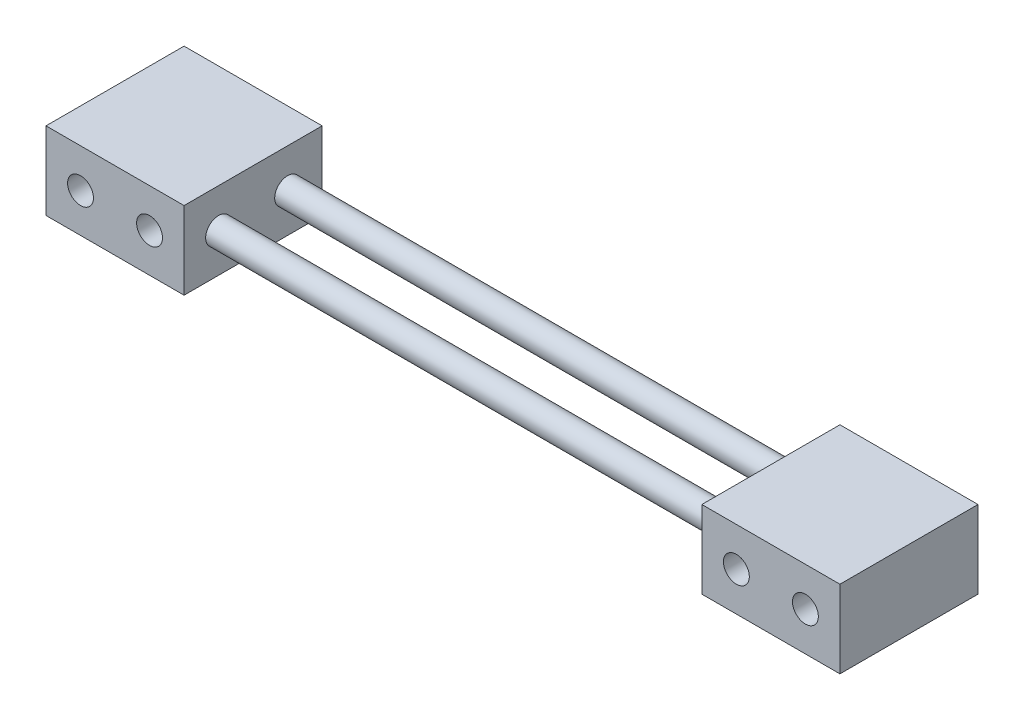
ISO-10303-21;
HEADER;
FILE_DESCRIPTION(('STEP AP214'),'2;1');
FILE_NAME('part.step','',(''),(''),'','','');
FILE_SCHEMA(('AUTOMOTIVE_DESIGN { 1 0 10303 214 1 1 1 1 }'));
ENDSEC;
DATA;
#1=APPLICATION_CONTEXT('core data for automotive mechanical design processes');
#2=APPLICATION_PROTOCOL_DEFINITION('international standard','automotive_design',2000,#1);
#3=PRODUCT_CONTEXT('',#1,'mechanical');
#4=PRODUCT('Part','Part','',(#3));
#5=PRODUCT_RELATED_PRODUCT_CATEGORY('part','',(#4));
#6=PRODUCT_DEFINITION_FORMATION('','',#4);
#7=PRODUCT_DEFINITION_CONTEXT('part definition',#1,'design');
#8=PRODUCT_DEFINITION('design','',#6,#7);
#9=PRODUCT_DEFINITION_SHAPE('','',#8);
#10=(LENGTH_UNIT() NAMED_UNIT(*) SI_UNIT(.MILLI.,.METRE.));
#11=(NAMED_UNIT(*) PLANE_ANGLE_UNIT() SI_UNIT($,.RADIAN.));
#12=(NAMED_UNIT(*) SI_UNIT($,.STERADIAN.) SOLID_ANGLE_UNIT());
#13=UNCERTAINTY_MEASURE_WITH_UNIT(LENGTH_MEASURE(1.E-05),#10,'distance_accuracy_value','');
#14=(GEOMETRIC_REPRESENTATION_CONTEXT(3) GLOBAL_UNCERTAINTY_ASSIGNED_CONTEXT((#13)) GLOBAL_UNIT_ASSIGNED_CONTEXT((#10,
#11,#12)) REPRESENTATION_CONTEXT('',''));
#15=CARTESIAN_POINT('',(0.,0.,0.));
#16=DIRECTION('',(0.,0.,1.));
#17=DIRECTION('',(1.,0.,0.));
#18=AXIS2_PLACEMENT_3D('',#15,#16,#17);
#19=CARTESIAN_POINT('',(0.,45.,0.));
#20=DIRECTION('',(-1.,0.,0.));
#21=DIRECTION('',(0.,0.,1.));
#22=AXIS2_PLACEMENT_3D('',#19,#20,#21);
#23=PLANE('',#22);
#24=CARTESIAN_POINT('',(0.,22.5,-20.));
#25=DIRECTION('',(-1.,0.,0.));
#26=DIRECTION('',(0.,0.,1.));
#27=AXIS2_PLACEMENT_3D('',#24,#25,#26);
#28=CIRCLE('',#27,7.5);
#29=CARTESIAN_POINT('',(0.,22.5,-12.5));
#30=VERTEX_POINT('',#29);
#31=EDGE_CURVE('E11',#30,#30,#28,.F.);
#32=ORIENTED_EDGE('',*,*,#31,.F.);
#33=EDGE_LOOP('',(#32));
#34=FACE_BOUND('',#33,.T.);
#35=CARTESIAN_POINT('',(0.,22.5,-60.));
#36=DIRECTION('',(-1.,0.,0.));
#37=DIRECTION('',(0.,0.,1.));
#38=AXIS2_PLACEMENT_3D('',#35,#36,#37);
#39=CIRCLE('',#38,7.50000000000001);
#40=CARTESIAN_POINT('',(0.,22.5,-52.5));
#41=VERTEX_POINT('',#40);
#42=EDGE_CURVE('E59',#41,#41,#39,.F.);
#43=ORIENTED_EDGE('',*,*,#42,.F.);
#44=EDGE_LOOP('',(#43));
#45=FACE_BOUND('',#44,.T.);
#46=DIRECTION('',(0.,0.,-1.));
#47=VECTOR('',#46,1.);
#48=CARTESIAN_POINT('',(0.,0.,0.));
#49=LINE('',#48,#47);
#50=CARTESIAN_POINT('',(0.,0.,0.));
#51=VERTEX_POINT('',#50);
#52=CARTESIAN_POINT('',(0.,0.,-80.));
#53=VERTEX_POINT('',#52);
#54=EDGE_CURVE('E195',#51,#53,#49,.T.);
#55=ORIENTED_EDGE('',*,*,#54,.T.);
#56=DIRECTION('',(0.,-1.,0.));
#57=VECTOR('',#56,1.);
#58=CARTESIAN_POINT('',(0.,45.,-80.));
#59=LINE('',#58,#57);
#60=CARTESIAN_POINT('',(0.,45.,-80.));
#61=VERTEX_POINT('',#60);
#62=EDGE_CURVE('E236',#61,#53,#59,.T.);
#63=ORIENTED_EDGE('',*,*,#62,.F.);
#64=DIRECTION('',(0.,0.,-1.));
#65=VECTOR('',#64,1.);
#66=CARTESIAN_POINT('',(0.,45.,0.));
#67=LINE('',#66,#65);
#68=CARTESIAN_POINT('',(0.,45.,0.));
#69=VERTEX_POINT('',#68);
#70=EDGE_CURVE('E207',#69,#61,#67,.T.);
#71=ORIENTED_EDGE('',*,*,#70,.F.);
#72=DIRECTION('',(0.,-1.,0.));
#73=VECTOR('',#72,1.);
#74=CARTESIAN_POINT('',(0.,45.,0.));
#75=LINE('',#74,#73);
#76=EDGE_CURVE('E217',#69,#51,#75,.T.);
#77=ORIENTED_EDGE('',*,*,#76,.T.);
#78=EDGE_LOOP('',(#55,#63,#71,#77));
#79=FACE_BOUND('',#78,.T.);
#80=ADVANCED_FACE('F50',(#34,#45,#79),#23,.F.);
#81=CARTESIAN_POINT('',(0.,45.,-80.));
#82=DIRECTION('',(0.,0.,1.));
#83=DIRECTION('',(1.,0.,0.));
#84=AXIS2_PLACEMENT_3D('',#81,#82,#83);
#85=PLANE('',#84);
#86=CARTESIAN_POINT('',(-60.,22.5,-80.));
#87=DIRECTION('',(0.,0.,1.));
#88=DIRECTION('',(1.,0.,0.));
#89=AXIS2_PLACEMENT_3D('',#86,#87,#88);
#90=CIRCLE('',#89,7.5);
#91=CARTESIAN_POINT('',(-52.5,22.5,-80.));
#92=VERTEX_POINT('',#91);
#93=EDGE_CURVE('E191',#92,#92,#90,.T.);
#94=ORIENTED_EDGE('',*,*,#93,.T.);
#95=EDGE_LOOP('',(#94));
#96=FACE_BOUND('',#95,.T.);
#97=CARTESIAN_POINT('',(-20.,22.5,-80.));
#98=DIRECTION('',(0.,0.,1.));
#99=DIRECTION('',(1.,0.,0.));
#100=AXIS2_PLACEMENT_3D('',#97,#98,#99);
#101=CIRCLE('',#100,7.5);
#102=CARTESIAN_POINT('',(-12.5,22.5,-80.));
#103=VERTEX_POINT('',#102);
#104=EDGE_CURVE('E187',#103,#103,#101,.T.);
#105=ORIENTED_EDGE('',*,*,#104,.T.);
#106=EDGE_LOOP('',(#105));
#107=FACE_BOUND('',#106,.T.);
#108=DIRECTION('',(-1.,0.,0.));
#109=VECTOR('',#108,1.);
#110=CARTESIAN_POINT('',(0.,0.,-80.));
#111=LINE('',#110,#109);
#112=CARTESIAN_POINT('',(-80.,0.,-80.));
#113=VERTEX_POINT('',#112);
#114=EDGE_CURVE('E221',#53,#113,#111,.T.);
#115=ORIENTED_EDGE('',*,*,#114,.T.);
#116=DIRECTION('',(0.,-1.,0.));
#117=VECTOR('',#116,1.);
#118=CARTESIAN_POINT('',(-80.,45.,-80.));
#119=LINE('',#118,#117);
#120=CARTESIAN_POINT('',(-80.,45.,-80.));
#121=VERTEX_POINT('',#120);
#122=EDGE_CURVE('E233',#121,#113,#119,.T.);
#123=ORIENTED_EDGE('',*,*,#122,.F.);
#124=DIRECTION('',(-1.,0.,0.));
#125=VECTOR('',#124,1.);
#126=CARTESIAN_POINT('',(0.,45.,-80.));
#127=LINE('',#126,#125);
#128=EDGE_CURVE('E99',#61,#121,#127,.T.);
#129=ORIENTED_EDGE('',*,*,#128,.F.);
#130=ORIENTED_EDGE('',*,*,#62,.T.);
#131=EDGE_LOOP('',(#115,#123,#129,#130));
#132=FACE_BOUND('',#131,.T.);
#133=ADVANCED_FACE('F246',(#96,#107,#132),#85,.F.);
#134=CARTESIAN_POINT('',(-80.,45.,0.));
#135=DIRECTION('',(1.,0.,0.));
#136=DIRECTION('',(0.,0.,-1.));
#137=AXIS2_PLACEMENT_3D('',#134,#135,#136);
#138=PLANE('',#137);
#139=DIRECTION('',(0.,0.,1.));
#140=VECTOR('',#139,1.);
#141=CARTESIAN_POINT('',(-80.,0.,0.));
#142=LINE('',#141,#140);
#143=CARTESIAN_POINT('',(-80.,0.,0.));
#144=VERTEX_POINT('',#143);
#145=EDGE_CURVE('E85',#113,#144,#142,.T.);
#146=ORIENTED_EDGE('',*,*,#145,.T.);
#147=DIRECTION('',(0.,-1.,0.));
#148=VECTOR('',#147,1.);
#149=CARTESIAN_POINT('',(-80.,45.,0.));
#150=LINE('',#149,#148);
#151=CARTESIAN_POINT('',(-80.,45.,0.));
#152=VERTEX_POINT('',#151);
#153=EDGE_CURVE('E230',#152,#144,#150,.T.);
#154=ORIENTED_EDGE('',*,*,#153,.F.);
#155=DIRECTION('',(0.,0.,1.));
#156=VECTOR('',#155,1.);
#157=CARTESIAN_POINT('',(-80.,45.,0.));
#158=LINE('',#157,#156);
#159=EDGE_CURVE('E212',#121,#152,#158,.T.);
#160=ORIENTED_EDGE('',*,*,#159,.F.);
#161=ORIENTED_EDGE('',*,*,#122,.T.);
#162=EDGE_LOOP('',(#146,#154,#160,#161));
#163=FACE_BOUND('',#162,.T.);
#164=ADVANCED_FACE('F254',(#163),#138,.F.);
#165=CARTESIAN_POINT('',(0.,45.,0.));
#166=DIRECTION('',(0.,0.,-1.));
#167=DIRECTION('',(-1.,0.,0.));
#168=AXIS2_PLACEMENT_3D('',#165,#166,#167);
#169=PLANE('',#168);
#170=CARTESIAN_POINT('',(-60.,22.5,0.));
#171=DIRECTION('',(0.,0.,1.));
#172=DIRECTION('',(1.,0.,0.));
#173=AXIS2_PLACEMENT_3D('',#170,#171,#172);
#174=CIRCLE('',#173,7.5);
#175=CARTESIAN_POINT('',(-52.5,22.5,0.));
#176=VERTEX_POINT('',#175);
#177=EDGE_CURVE('E196',#176,#176,#174,.T.);
#178=ORIENTED_EDGE('',*,*,#177,.F.);
#179=EDGE_LOOP('',(#178));
#180=FACE_BOUND('',#179,.T.);
#181=CARTESIAN_POINT('',(-20.,22.5,0.));
#182=DIRECTION('',(0.,0.,1.));
#183=DIRECTION('',(1.,0.,0.));
#184=AXIS2_PLACEMENT_3D('',#181,#182,#183);
#185=CIRCLE('',#184,7.5);
#186=CARTESIAN_POINT('',(-12.5,22.5,0.));
#187=VERTEX_POINT('',#186);
#188=EDGE_CURVE('E200',#187,#187,#185,.T.);
#189=ORIENTED_EDGE('',*,*,#188,.F.);
#190=EDGE_LOOP('',(#189));
#191=FACE_BOUND('',#190,.T.);
#192=DIRECTION('',(1.,0.,0.));
#193=VECTOR('',#192,1.);
#194=CARTESIAN_POINT('',(0.,0.,0.));
#195=LINE('',#194,#193);
#196=EDGE_CURVE('E91',#144,#51,#195,.T.);
#197=ORIENTED_EDGE('',*,*,#196,.T.);
#198=ORIENTED_EDGE('',*,*,#76,.F.);
#199=DIRECTION('',(1.,0.,0.));
#200=VECTOR('',#199,1.);
#201=CARTESIAN_POINT('',(0.,45.,0.));
#202=LINE('',#201,#200);
#203=EDGE_CURVE('E67',#152,#69,#202,.T.);
#204=ORIENTED_EDGE('',*,*,#203,.F.);
#205=ORIENTED_EDGE('',*,*,#153,.T.);
#206=EDGE_LOOP('',(#197,#198,#204,#205));
#207=FACE_BOUND('',#206,.T.);
#208=ADVANCED_FACE('F259',(#180,#191,#207),#169,.F.);
#209=CARTESIAN_POINT('',(0.,45.,0.));
#210=DIRECTION('',(0.,1.,0.));
#211=DIRECTION('',(0.,0.,1.));
#212=AXIS2_PLACEMENT_3D('',#209,#210,#211);
#213=PLANE('',#212);
#214=ORIENTED_EDGE('',*,*,#70,.T.);
#215=ORIENTED_EDGE('',*,*,#128,.T.);
#216=ORIENTED_EDGE('',*,*,#159,.T.);
#217=ORIENTED_EDGE('',*,*,#203,.T.);
#218=EDGE_LOOP('',(#214,#215,#216,#217));
#219=FACE_BOUND('',#218,.T.);
#220=ADVANCED_FACE('F265',(#219),#213,.T.);
#221=CARTESIAN_POINT('',(0.,0.,0.));
#222=DIRECTION('',(0.,1.,0.));
#223=DIRECTION('',(0.,0.,1.));
#224=AXIS2_PLACEMENT_3D('',#221,#222,#223);
#225=PLANE('',#224);
#226=ORIENTED_EDGE('',*,*,#54,.F.);
#227=ORIENTED_EDGE('',*,*,#196,.F.);
#228=ORIENTED_EDGE('',*,*,#145,.F.);
#229=ORIENTED_EDGE('',*,*,#114,.F.);
#230=EDGE_LOOP('',(#226,#227,#228,#229));
#231=FACE_BOUND('',#230,.T.);
#232=ADVANCED_FACE('F252',(#231),#225,.F.);
#233=CARTESIAN_POINT('',(-20.,22.5,-80.));
#234=DIRECTION('',(0.,0.,1.));
#235=DIRECTION('',(1.,0.,0.));
#236=AXIS2_PLACEMENT_3D('',#233,#234,#235);
#237=CYLINDRICAL_SURFACE('',#236,7.5);
#238=ORIENTED_EDGE('',*,*,#104,.F.);
#239=EDGE_LOOP('',(#238));
#240=FACE_BOUND('',#239,.T.);
#241=ORIENTED_EDGE('',*,*,#188,.T.);
#242=EDGE_LOOP('',(#241));
#243=FACE_BOUND('',#242,.T.);
#244=ADVANCED_FACE('F269',(#240,#243),#237,.F.);
#245=CARTESIAN_POINT('',(-60.,22.5,-80.));
#246=DIRECTION('',(0.,0.,1.));
#247=DIRECTION('',(1.,0.,0.));
#248=AXIS2_PLACEMENT_3D('',#245,#246,#247);
#249=CYLINDRICAL_SURFACE('',#248,7.5);
#250=ORIENTED_EDGE('',*,*,#93,.F.);
#251=EDGE_LOOP('',(#250));
#252=FACE_BOUND('',#251,.T.);
#253=ORIENTED_EDGE('',*,*,#177,.T.);
#254=EDGE_LOOP('',(#253));
#255=FACE_BOUND('',#254,.T.);
#256=ADVANCED_FACE('F274',(#252,#255),#249,.F.);
#257=CARTESIAN_POINT('',(300.,22.5,-60.));
#258=DIRECTION('',(-1.,0.,0.));
#259=DIRECTION('',(0.,0.,1.));
#260=AXIS2_PLACEMENT_3D('',#257,#258,#259);
#261=CYLINDRICAL_SURFACE('',#260,7.50000000000001);
#262=CARTESIAN_POINT('',(300.,22.5,-60.));
#263=DIRECTION('',(1.,0.,0.));
#264=DIRECTION('',(0.,0.,-1.));
#265=AXIS2_PLACEMENT_3D('',#262,#263,#264);
#266=CIRCLE('',#265,7.50000000000001);
#267=CARTESIAN_POINT('',(300.,22.5,-67.5));
#268=VERTEX_POINT('',#267);
#269=EDGE_CURVE('E138',#268,#268,#266,.T.);
#270=ORIENTED_EDGE('',*,*,#269,.F.);
#271=EDGE_LOOP('',(#270));
#272=FACE_BOUND('',#271,.T.);
#273=ORIENTED_EDGE('',*,*,#42,.T.);
#274=EDGE_LOOP('',(#273));
#275=FACE_BOUND('',#274,.T.);
#276=ADVANCED_FACE('F242',(#272,#275),#261,.T.);
#277=CARTESIAN_POINT('',(300.,22.5,-20.));
#278=DIRECTION('',(-1.,0.,0.));
#279=DIRECTION('',(0.,0.,1.));
#280=AXIS2_PLACEMENT_3D('',#277,#278,#279);
#281=CYLINDRICAL_SURFACE('',#280,7.5);
#282=CARTESIAN_POINT('',(300.,22.5,-20.));
#283=DIRECTION('',(1.,0.,0.));
#284=DIRECTION('',(0.,0.,-1.));
#285=AXIS2_PLACEMENT_3D('',#282,#283,#284);
#286=CIRCLE('',#285,7.5);
#287=CARTESIAN_POINT('',(300.,22.5,-27.5));
#288=VERTEX_POINT('',#287);
#289=EDGE_CURVE('E183',#288,#288,#286,.T.);
#290=ORIENTED_EDGE('',*,*,#289,.F.);
#291=EDGE_LOOP('',(#290));
#292=FACE_BOUND('',#291,.T.);
#293=ORIENTED_EDGE('',*,*,#31,.T.);
#294=EDGE_LOOP('',(#293));
#295=FACE_BOUND('',#294,.T.);
#296=ADVANCED_FACE('F281',(#292,#295),#281,.T.);
#297=CARTESIAN_POINT('',(300.,45.,0.));
#298=DIRECTION('',(-1.,0.,0.));
#299=DIRECTION('',(0.,0.,1.));
#300=AXIS2_PLACEMENT_3D('',#297,#298,#299);
#301=PLANE('',#300);
#302=ORIENTED_EDGE('',*,*,#269,.T.);
#303=EDGE_LOOP('',(#302));
#304=FACE_BOUND('',#303,.T.);
#305=ORIENTED_EDGE('',*,*,#289,.T.);
#306=EDGE_LOOP('',(#305));
#307=FACE_BOUND('',#306,.T.);
#308=DIRECTION('',(0.,0.,-1.));
#309=VECTOR('',#308,1.);
#310=CARTESIAN_POINT('',(300.,0.,0.));
#311=LINE('',#310,#309);
#312=CARTESIAN_POINT('',(300.,0.,0.));
#313=VERTEX_POINT('',#312);
#314=CARTESIAN_POINT('',(300.,0.,-80.));
#315=VERTEX_POINT('',#314);
#316=EDGE_CURVE('E132',#313,#315,#311,.T.);
#317=ORIENTED_EDGE('',*,*,#316,.F.);
#318=DIRECTION('',(0.,-1.,0.));
#319=VECTOR('',#318,1.);
#320=CARTESIAN_POINT('',(300.,45.,0.));
#321=LINE('',#320,#319);
#322=CARTESIAN_POINT('',(300.,45.,0.));
#323=VERTEX_POINT('',#322);
#324=EDGE_CURVE('E126',#323,#313,#321,.T.);
#325=ORIENTED_EDGE('',*,*,#324,.F.);
#326=DIRECTION('',(0.,0.,-1.));
#327=VECTOR('',#326,1.);
#328=CARTESIAN_POINT('',(300.,45.,0.));
#329=LINE('',#328,#327);
#330=CARTESIAN_POINT('',(300.,45.,-80.));
#331=VERTEX_POINT('',#330);
#332=EDGE_CURVE('E129',#323,#331,#329,.T.);
#333=ORIENTED_EDGE('',*,*,#332,.T.);
#334=DIRECTION('',(0.,-1.,0.));
#335=VECTOR('',#334,1.);
#336=CARTESIAN_POINT('',(300.,45.,-80.));
#337=LINE('',#336,#335);
#338=EDGE_CURVE('E162',#331,#315,#337,.T.);
#339=ORIENTED_EDGE('',*,*,#338,.T.);
#340=EDGE_LOOP('',(#317,#325,#333,#339));
#341=FACE_BOUND('',#340,.T.);
#342=ADVANCED_FACE('F128',(#304,#307,#341),#301,.T.);
#343=CARTESIAN_POINT('',(300.,45.,0.));
#344=DIRECTION('',(0.,0.,1.));
#345=DIRECTION('',(1.,0.,0.));
#346=AXIS2_PLACEMENT_3D('',#343,#344,#345);
#347=PLANE('',#346);
#348=CARTESIAN_POINT('',(360.,22.5,0.));
#349=DIRECTION('',(0.,0.,-1.));
#350=DIRECTION('',(-1.,0.,0.));
#351=AXIS2_PLACEMENT_3D('',#348,#349,#350);
#352=CIRCLE('',#351,7.5);
#353=CARTESIAN_POINT('',(352.5,22.5,0.));
#354=VERTEX_POINT('',#353);
#355=EDGE_CURVE('E320',#354,#354,#352,.T.);
#356=ORIENTED_EDGE('',*,*,#355,.T.);
#357=EDGE_LOOP('',(#356));
#358=FACE_BOUND('',#357,.T.);
#359=CARTESIAN_POINT('',(320.,22.5,0.));
#360=DIRECTION('',(0.,0.,-1.));
#361=DIRECTION('',(-1.,0.,0.));
#362=AXIS2_PLACEMENT_3D('',#359,#360,#361);
#363=CIRCLE('',#362,7.5);
#364=CARTESIAN_POINT('',(312.5,22.5,0.));
#365=VERTEX_POINT('',#364);
#366=EDGE_CURVE('E328',#365,#365,#363,.T.);
#367=ORIENTED_EDGE('',*,*,#366,.T.);
#368=EDGE_LOOP('',(#367));
#369=FACE_BOUND('',#368,.T.);
#370=DIRECTION('',(-1.,0.,0.));
#371=VECTOR('',#370,1.);
#372=CARTESIAN_POINT('',(300.,0.,0.));
#373=LINE('',#372,#371);
#374=CARTESIAN_POINT('',(380.,0.,0.));
#375=VERTEX_POINT('',#374);
#376=EDGE_CURVE('E165',#375,#313,#373,.T.);
#377=ORIENTED_EDGE('',*,*,#376,.F.);
#378=DIRECTION('',(0.,-1.,0.));
#379=VECTOR('',#378,1.);
#380=CARTESIAN_POINT('',(380.,45.,0.));
#381=LINE('',#380,#379);
#382=CARTESIAN_POINT('',(380.,45.,0.));
#383=VERTEX_POINT('',#382);
#384=EDGE_CURVE('E139',#383,#375,#381,.T.);
#385=ORIENTED_EDGE('',*,*,#384,.F.);
#386=DIRECTION('',(-1.,0.,0.));
#387=VECTOR('',#386,1.);
#388=CARTESIAN_POINT('',(300.,45.,0.));
#389=LINE('',#388,#387);
#390=EDGE_CURVE('E145',#383,#323,#389,.T.);
#391=ORIENTED_EDGE('',*,*,#390,.T.);
#392=ORIENTED_EDGE('',*,*,#324,.T.);
#393=EDGE_LOOP('',(#377,#385,#391,#392));
#394=FACE_BOUND('',#393,.T.);
#395=ADVANCED_FACE('F152',(#358,#369,#394),#347,.T.);
#396=CARTESIAN_POINT('',(380.,45.,0.));
#397=DIRECTION('',(1.,0.,0.));
#398=DIRECTION('',(0.,0.,-1.));
#399=AXIS2_PLACEMENT_3D('',#396,#397,#398);
#400=PLANE('',#399);
#401=DIRECTION('',(0.,0.,1.));
#402=VECTOR('',#401,1.);
#403=CARTESIAN_POINT('',(380.,0.,0.));
#404=LINE('',#403,#402);
#405=CARTESIAN_POINT('',(380.,0.,-80.));
#406=VERTEX_POINT('',#405);
#407=EDGE_CURVE('E169',#406,#375,#404,.T.);
#408=ORIENTED_EDGE('',*,*,#407,.F.);
#409=DIRECTION('',(0.,-1.,0.));
#410=VECTOR('',#409,1.);
#411=CARTESIAN_POINT('',(380.,45.,-80.));
#412=LINE('',#411,#410);
#413=CARTESIAN_POINT('',(380.,45.,-80.));
#414=VERTEX_POINT('',#413);
#415=EDGE_CURVE('E178',#414,#406,#412,.T.);
#416=ORIENTED_EDGE('',*,*,#415,.F.);
#417=DIRECTION('',(0.,0.,1.));
#418=VECTOR('',#417,1.);
#419=CARTESIAN_POINT('',(380.,45.,0.));
#420=LINE('',#419,#418);
#421=EDGE_CURVE('E154',#414,#383,#420,.T.);
#422=ORIENTED_EDGE('',*,*,#421,.T.);
#423=ORIENTED_EDGE('',*,*,#384,.T.);
#424=EDGE_LOOP('',(#408,#416,#422,#423));
#425=FACE_BOUND('',#424,.T.);
#426=ADVANCED_FACE('F291',(#425),#400,.T.);
#427=CARTESIAN_POINT('',(300.,45.,-80.));
#428=DIRECTION('',(0.,0.,-1.));
#429=DIRECTION('',(-1.,0.,0.));
#430=AXIS2_PLACEMENT_3D('',#427,#428,#429);
#431=PLANE('',#430);
#432=CARTESIAN_POINT('',(360.,22.5,-80.));
#433=DIRECTION('',(0.,0.,-1.));
#434=DIRECTION('',(-1.,0.,0.));
#435=AXIS2_PLACEMENT_3D('',#432,#433,#434);
#436=CIRCLE('',#435,7.5);
#437=CARTESIAN_POINT('',(352.5,22.5,-80.));
#438=VERTEX_POINT('',#437);
#439=EDGE_CURVE('E166',#438,#438,#436,.T.);
#440=ORIENTED_EDGE('',*,*,#439,.F.);
#441=EDGE_LOOP('',(#440));
#442=FACE_BOUND('',#441,.T.);
#443=CARTESIAN_POINT('',(320.,22.5,-80.));
#444=DIRECTION('',(0.,0.,-1.));
#445=DIRECTION('',(-1.,0.,0.));
#446=AXIS2_PLACEMENT_3D('',#443,#444,#445);
#447=CIRCLE('',#446,7.5);
#448=CARTESIAN_POINT('',(312.5,22.5,-80.));
#449=VERTEX_POINT('',#448);
#450=EDGE_CURVE('E322',#449,#449,#447,.T.);
#451=ORIENTED_EDGE('',*,*,#450,.F.);
#452=EDGE_LOOP('',(#451));
#453=FACE_BOUND('',#452,.T.);
#454=DIRECTION('',(1.,0.,0.));
#455=VECTOR('',#454,1.);
#456=CARTESIAN_POINT('',(300.,0.,-80.));
#457=LINE('',#456,#455);
#458=EDGE_CURVE('E150',#315,#406,#457,.T.);
#459=ORIENTED_EDGE('',*,*,#458,.F.);
#460=ORIENTED_EDGE('',*,*,#338,.F.);
#461=DIRECTION('',(1.,0.,0.));
#462=VECTOR('',#461,1.);
#463=CARTESIAN_POINT('',(300.,45.,-80.));
#464=LINE('',#463,#462);
#465=EDGE_CURVE('E148',#331,#414,#464,.T.);
#466=ORIENTED_EDGE('',*,*,#465,.T.);
#467=ORIENTED_EDGE('',*,*,#415,.T.);
#468=EDGE_LOOP('',(#459,#460,#466,#467));
#469=FACE_BOUND('',#468,.T.);
#470=ADVANCED_FACE('F295',(#442,#453,#469),#431,.T.);
#471=CARTESIAN_POINT('',(300.,45.,0.));
#472=DIRECTION('',(0.,1.,0.));
#473=DIRECTION('',(0.,0.,1.));
#474=AXIS2_PLACEMENT_3D('',#471,#472,#473);
#475=PLANE('',#474);
#476=ORIENTED_EDGE('',*,*,#332,.F.);
#477=ORIENTED_EDGE('',*,*,#390,.F.);
#478=ORIENTED_EDGE('',*,*,#421,.F.);
#479=ORIENTED_EDGE('',*,*,#465,.F.);
#480=EDGE_LOOP('',(#476,#477,#478,#479));
#481=FACE_BOUND('',#480,.T.);
#482=ADVANCED_FACE('F143',(#481),#475,.T.);
#483=CARTESIAN_POINT('',(300.,0.,0.));
#484=DIRECTION('',(0.,1.,0.));
#485=DIRECTION('',(0.,0.,1.));
#486=AXIS2_PLACEMENT_3D('',#483,#484,#485);
#487=PLANE('',#486);
#488=ORIENTED_EDGE('',*,*,#316,.T.);
#489=ORIENTED_EDGE('',*,*,#458,.T.);
#490=ORIENTED_EDGE('',*,*,#407,.T.);
#491=ORIENTED_EDGE('',*,*,#376,.T.);
#492=EDGE_LOOP('',(#488,#489,#490,#491));
#493=FACE_BOUND('',#492,.T.);
#494=ADVANCED_FACE('F300',(#493),#487,.F.);
#495=CARTESIAN_POINT('',(320.,22.5,-80.));
#496=DIRECTION('',(0.,0.,1.));
#497=DIRECTION('',(1.,0.,0.));
#498=AXIS2_PLACEMENT_3D('',#495,#496,#497);
#499=CYLINDRICAL_SURFACE('',#498,7.5);
#500=ORIENTED_EDGE('',*,*,#450,.T.);
#501=EDGE_LOOP('',(#500));
#502=FACE_BOUND('',#501,.T.);
#503=ORIENTED_EDGE('',*,*,#366,.F.);
#504=EDGE_LOOP('',(#503));
#505=FACE_BOUND('',#504,.T.);
#506=ADVANCED_FACE('F303',(#502,#505),#499,.F.);
#507=CARTESIAN_POINT('',(360.,22.5,-80.));
#508=DIRECTION('',(0.,0.,1.));
#509=DIRECTION('',(1.,0.,0.));
#510=AXIS2_PLACEMENT_3D('',#507,#508,#509);
#511=CYLINDRICAL_SURFACE('',#510,7.5);
#512=ORIENTED_EDGE('',*,*,#439,.T.);
#513=EDGE_LOOP('',(#512));
#514=FACE_BOUND('',#513,.T.);
#515=ORIENTED_EDGE('',*,*,#355,.F.);
#516=EDGE_LOOP('',(#515));
#517=FACE_BOUND('',#516,.T.);
#518=ADVANCED_FACE('F309',(#514,#517),#511,.F.);
#519=CLOSED_SHELL('',(#80,#133,#164,#208,#220,#232,#244,#256,#276,#296,#342,#395,#426,#470,#482,
#494,#506,#518));
#520=MANIFOLD_SOLID_BREP('B2',#519);
#521=ADVANCED_BREP_SHAPE_REPRESENTATION('',(#18,#520),#14);
#522=SHAPE_DEFINITION_REPRESENTATION(#9,#521);
ENDSEC;
END-ISO-10303-21;
